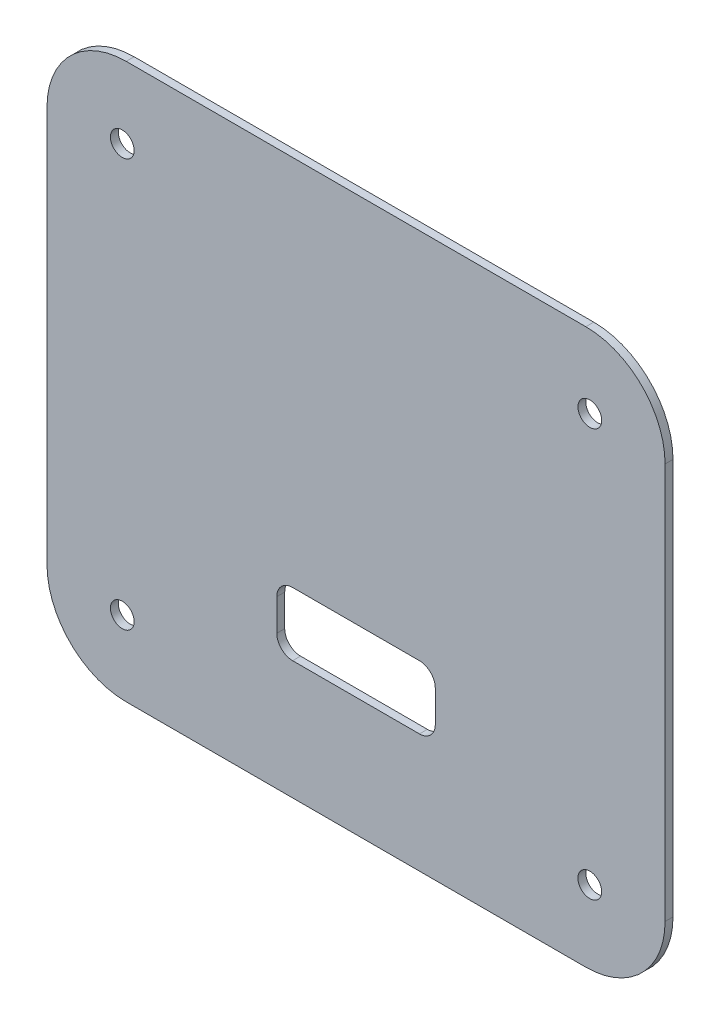
ISO-10303-21;
HEADER;
FILE_DESCRIPTION(('STEP AP214'),'2;1');
FILE_NAME('part.step','',(''),(''),'','','');
FILE_SCHEMA(('AUTOMOTIVE_DESIGN { 1 0 10303 214 1 1 1 1 }'));
ENDSEC;
DATA;
#1=APPLICATION_CONTEXT('core data for automotive mechanical design processes');
#2=APPLICATION_PROTOCOL_DEFINITION('international standard','automotive_design',2000,#1);
#3=PRODUCT_CONTEXT('',#1,'mechanical');
#4=PRODUCT('Part','Part','',(#3));
#5=PRODUCT_RELATED_PRODUCT_CATEGORY('part','',(#4));
#6=PRODUCT_DEFINITION_FORMATION('','',#4);
#7=PRODUCT_DEFINITION_CONTEXT('part definition',#1,'design');
#8=PRODUCT_DEFINITION('design','',#6,#7);
#9=PRODUCT_DEFINITION_SHAPE('','',#8);
#10=(LENGTH_UNIT() NAMED_UNIT(*) SI_UNIT(.MILLI.,.METRE.));
#11=(NAMED_UNIT(*) PLANE_ANGLE_UNIT() SI_UNIT($,.RADIAN.));
#12=(NAMED_UNIT(*) SI_UNIT($,.STERADIAN.) SOLID_ANGLE_UNIT());
#13=UNCERTAINTY_MEASURE_WITH_UNIT(LENGTH_MEASURE(1.E-05),#10,'distance_accuracy_value','');
#14=(GEOMETRIC_REPRESENTATION_CONTEXT(3) GLOBAL_UNCERTAINTY_ASSIGNED_CONTEXT((#13)) GLOBAL_UNIT_ASSIGNED_CONTEXT((#10,
#11,#12)) REPRESENTATION_CONTEXT('',''));
#15=CARTESIAN_POINT('',(0.,0.,0.));
#16=DIRECTION('',(0.,0.,1.));
#17=DIRECTION('',(1.,0.,0.));
#18=AXIS2_PLACEMENT_3D('',#15,#16,#17);
#19=CARTESIAN_POINT('',(38.9246009024166,0.,1.));
#20=DIRECTION('',(1.,0.,0.));
#21=DIRECTION('',(0.,1.,0.));
#22=AXIS2_PLACEMENT_3D('',#19,#20,#21);
#23=PLANE('',#22);
#24=DIRECTION('',(0.,-1.,0.));
#25=VECTOR('',#24,1.);
#26=CARTESIAN_POINT('',(38.9246009024166,0.,0.));
#27=LINE('',#26,#25);
#28=CARTESIAN_POINT('',(38.9246009024166,29.9501900989278,0.));
#29=VERTEX_POINT('',#28);
#30=CARTESIAN_POINT('',(38.9246009024166,-20.0498099010722,0.));
#31=VERTEX_POINT('',#30);
#32=EDGE_CURVE('E167',#29,#31,#27,.T.);
#33=ORIENTED_EDGE('',*,*,#32,.F.);
#34=DIRECTION('',(0.,0.,-1.));
#35=VECTOR('',#34,1.);
#36=CARTESIAN_POINT('',(38.9246009024166,29.9501900989278,1.));
#37=LINE('',#36,#35);
#38=CARTESIAN_POINT('',(38.9246009024166,29.9501900989278,1.));
#39=VERTEX_POINT('',#38);
#40=EDGE_CURVE('E189',#29,#39,#37,.F.);
#41=ORIENTED_EDGE('',*,*,#40,.T.);
#42=DIRECTION('',(0.,-1.,0.));
#43=VECTOR('',#42,1.);
#44=CARTESIAN_POINT('',(38.9246009024166,0.,1.));
#45=LINE('',#44,#43);
#46=CARTESIAN_POINT('',(38.9246009024166,-20.0498099010722,1.));
#47=VERTEX_POINT('',#46);
#48=EDGE_CURVE('E268',#39,#47,#45,.T.);
#49=ORIENTED_EDGE('',*,*,#48,.T.);
#50=DIRECTION('',(0.,0.,-1.));
#51=VECTOR('',#50,1.);
#52=CARTESIAN_POINT('',(38.9246009024166,-20.0498099010722,0.));
#53=LINE('',#52,#51);
#54=EDGE_CURVE('E186',#47,#31,#53,.T.);
#55=ORIENTED_EDGE('',*,*,#54,.T.);
#56=EDGE_LOOP('',(#33,#41,#49,#55));
#57=FACE_BOUND('',#56,.T.);
#58=ADVANCED_FACE('F32',(#57),#23,.T.);
#59=CARTESIAN_POINT('',(0.,39.9501900989278,1.));
#60=DIRECTION('',(0.,1.,0.));
#61=DIRECTION('',(0.,0.,1.));
#62=AXIS2_PLACEMENT_3D('',#59,#60,#61);
#63=PLANE('',#62);
#64=DIRECTION('',(1.,0.,0.));
#65=VECTOR('',#64,1.);
#66=CARTESIAN_POINT('',(0.,39.9501900989278,1.));
#67=LINE('',#66,#65);
#68=CARTESIAN_POINT('',(-29.0753990975834,39.9501900989278,1.));
#69=VERTEX_POINT('',#68);
#70=CARTESIAN_POINT('',(28.9246009024166,39.9501900989278,1.));
#71=VERTEX_POINT('',#70);
#72=EDGE_CURVE('E271',#69,#71,#67,.T.);
#73=ORIENTED_EDGE('',*,*,#72,.T.);
#74=DIRECTION('',(0.,0.,-1.));
#75=VECTOR('',#74,1.);
#76=CARTESIAN_POINT('',(28.9246009024166,39.9501900989278,1.));
#77=LINE('',#76,#75);
#78=CARTESIAN_POINT('',(28.9246009024166,39.9501900989278,0.));
#79=VERTEX_POINT('',#78);
#80=EDGE_CURVE('E166',#71,#79,#77,.T.);
#81=ORIENTED_EDGE('',*,*,#80,.T.);
#82=DIRECTION('',(1.,0.,0.));
#83=VECTOR('',#82,1.);
#84=CARTESIAN_POINT('',(0.,39.9501900989278,0.));
#85=LINE('',#84,#83);
#86=CARTESIAN_POINT('',(-29.0753990975834,39.9501900989278,0.));
#87=VERTEX_POINT('',#86);
#88=EDGE_CURVE('E149',#87,#79,#85,.T.);
#89=ORIENTED_EDGE('',*,*,#88,.F.);
#90=DIRECTION('',(0.,0.,-1.));
#91=VECTOR('',#90,1.);
#92=CARTESIAN_POINT('',(-29.0753990975834,39.9501900989278,1.));
#93=LINE('',#92,#91);
#94=EDGE_CURVE('E163',#87,#69,#93,.F.);
#95=ORIENTED_EDGE('',*,*,#94,.T.);
#96=EDGE_LOOP('',(#73,#81,#89,#95));
#97=FACE_BOUND('',#96,.T.);
#98=ADVANCED_FACE('F162',(#97),#63,.T.);
#99=CARTESIAN_POINT('',(-39.0753990975834,0.,1.));
#100=DIRECTION('',(1.,0.,0.));
#101=DIRECTION('',(0.,1.,0.));
#102=AXIS2_PLACEMENT_3D('',#99,#100,#101);
#103=PLANE('',#102);
#104=DIRECTION('',(0.,-1.,0.));
#105=VECTOR('',#104,1.);
#106=CARTESIAN_POINT('',(-39.0753990975834,0.,1.));
#107=LINE('',#106,#105);
#108=CARTESIAN_POINT('',(-39.0753990975834,29.9501900989278,1.));
#109=VERTEX_POINT('',#108);
#110=CARTESIAN_POINT('',(-39.0753990975834,-20.0498099010722,1.));
#111=VERTEX_POINT('',#110);
#112=EDGE_CURVE('E273',#109,#111,#107,.T.);
#113=ORIENTED_EDGE('',*,*,#112,.F.);
#114=DIRECTION('',(0.,0.,-1.));
#115=VECTOR('',#114,1.);
#116=CARTESIAN_POINT('',(-39.0753990975834,29.9501900989278,0.));
#117=LINE('',#116,#115);
#118=CARTESIAN_POINT('',(-39.0753990975834,29.9501900989278,0.));
#119=VERTEX_POINT('',#118);
#120=EDGE_CURVE('E200',#109,#119,#117,.T.);
#121=ORIENTED_EDGE('',*,*,#120,.T.);
#122=DIRECTION('',(0.,-1.,0.));
#123=VECTOR('',#122,1.);
#124=CARTESIAN_POINT('',(-39.0753990975834,0.,0.));
#125=LINE('',#124,#123);
#126=CARTESIAN_POINT('',(-39.0753990975834,-20.0498099010722,0.));
#127=VERTEX_POINT('',#126);
#128=EDGE_CURVE('E151',#119,#127,#125,.T.);
#129=ORIENTED_EDGE('',*,*,#128,.T.);
#130=DIRECTION('',(0.,0.,-1.));
#131=VECTOR('',#130,1.);
#132=CARTESIAN_POINT('',(-39.0753990975834,-20.0498099010722,1.));
#133=LINE('',#132,#131);
#134=EDGE_CURVE('E198',#127,#111,#133,.F.);
#135=ORIENTED_EDGE('',*,*,#134,.T.);
#136=EDGE_LOOP('',(#113,#121,#129,#135));
#137=FACE_BOUND('',#136,.T.);
#138=ADVANCED_FACE('F332',(#137),#103,.F.);
#139=CARTESIAN_POINT('',(0.,-15.0498099010722,1.));
#140=DIRECTION('',(0.,1.,0.));
#141=DIRECTION('',(0.,0.,1.));
#142=AXIS2_PLACEMENT_3D('',#139,#140,#141);
#143=PLANE('',#142);
#144=DIRECTION('',(1.,0.,0.));
#145=VECTOR('',#144,1.);
#146=CARTESIAN_POINT('',(0.,-15.0498099010722,1.));
#147=LINE('',#146,#145);
#148=CARTESIAN_POINT('',(-8.07539909758339,-15.0498099010722,1.));
#149=VERTEX_POINT('',#148);
#150=CARTESIAN_POINT('',(7.92460090241661,-15.0498099010722,1.));
#151=VERTEX_POINT('',#150);
#152=EDGE_CURVE('E256',#149,#151,#147,.T.);
#153=ORIENTED_EDGE('',*,*,#152,.T.);
#154=DIRECTION('',(0.,0.,-1.));
#155=VECTOR('',#154,1.);
#156=CARTESIAN_POINT('',(7.92460090241661,-15.0498099010722,0.));
#157=LINE('',#156,#155);
#158=CARTESIAN_POINT('',(7.92460090241661,-15.0498099010722,0.));
#159=VERTEX_POINT('',#158);
#160=EDGE_CURVE('E209',#151,#159,#157,.T.);
#161=ORIENTED_EDGE('',*,*,#160,.T.);
#162=DIRECTION('',(1.,0.,0.));
#163=VECTOR('',#162,1.);
#164=CARTESIAN_POINT('',(0.,-15.0498099010722,0.));
#165=LINE('',#164,#163);
#166=CARTESIAN_POINT('',(-8.07539909758339,-15.0498099010722,0.));
#167=VERTEX_POINT('',#166);
#168=EDGE_CURVE('E242',#167,#159,#165,.T.);
#169=ORIENTED_EDGE('',*,*,#168,.F.);
#170=DIRECTION('',(0.,0.,-1.));
#171=VECTOR('',#170,1.);
#172=CARTESIAN_POINT('',(-8.07539909758339,-15.0498099010722,1.));
#173=LINE('',#172,#171);
#174=EDGE_CURVE('E207',#167,#149,#173,.F.);
#175=ORIENTED_EDGE('',*,*,#174,.T.);
#176=EDGE_LOOP('',(#153,#161,#169,#175));
#177=FACE_BOUND('',#176,.T.);
#178=ADVANCED_FACE('F249',(#177),#143,.T.);
#179=CARTESIAN_POINT('',(-10.0753990975834,0.,1.));
#180=DIRECTION('',(-1.,0.,0.));
#181=DIRECTION('',(0.,0.,1.));
#182=AXIS2_PLACEMENT_3D('',#179,#180,#181);
#183=PLANE('',#182);
#184=DIRECTION('',(0.,1.,0.));
#185=VECTOR('',#184,1.);
#186=CARTESIAN_POINT('',(-10.0753990975834,0.,0.));
#187=LINE('',#186,#185);
#188=CARTESIAN_POINT('',(-10.0753990975834,-13.0498099010722,0.));
#189=VERTEX_POINT('',#188);
#190=CARTESIAN_POINT('',(-10.0753990975834,-9.04980990107219,0.));
#191=VERTEX_POINT('',#190);
#192=EDGE_CURVE('E243',#189,#191,#187,.T.);
#193=ORIENTED_EDGE('',*,*,#192,.T.);
#194=DIRECTION('',(0.,0.,-1.));
#195=VECTOR('',#194,1.);
#196=CARTESIAN_POINT('',(-10.0753990975834,-9.04980990107219,1.));
#197=LINE('',#196,#195);
#198=CARTESIAN_POINT('',(-10.0753990975834,-9.04980990107219,1.));
#199=VERTEX_POINT('',#198);
#200=EDGE_CURVE('E47',#191,#199,#197,.F.);
#201=ORIENTED_EDGE('',*,*,#200,.T.);
#202=DIRECTION('',(0.,1.,0.));
#203=VECTOR('',#202,1.);
#204=CARTESIAN_POINT('',(-10.0753990975834,0.,1.));
#205=LINE('',#204,#203);
#206=CARTESIAN_POINT('',(-10.0753990975834,-13.0498099010722,1.));
#207=VERTEX_POINT('',#206);
#208=EDGE_CURVE('E253',#207,#199,#205,.T.);
#209=ORIENTED_EDGE('',*,*,#208,.F.);
#210=DIRECTION('',(0.,0.,-1.));
#211=VECTOR('',#210,1.);
#212=CARTESIAN_POINT('',(-10.0753990975834,-13.0498099010722,1.));
#213=LINE('',#212,#211);
#214=EDGE_CURVE('E222',#207,#189,#213,.T.);
#215=ORIENTED_EDGE('',*,*,#214,.T.);
#216=EDGE_LOOP('',(#193,#201,#209,#215));
#217=FACE_BOUND('',#216,.T.);
#218=ADVANCED_FACE('F252',(#217),#183,.F.);
#219=CARTESIAN_POINT('',(0.,-7.04980990107219,1.));
#220=DIRECTION('',(0.,1.,0.));
#221=DIRECTION('',(0.,0.,1.));
#222=AXIS2_PLACEMENT_3D('',#219,#220,#221);
#223=PLANE('',#222);
#224=DIRECTION('',(1.,0.,0.));
#225=VECTOR('',#224,1.);
#226=CARTESIAN_POINT('',(0.,-7.04980990107219,0.));
#227=LINE('',#226,#225);
#228=CARTESIAN_POINT('',(-8.07539909758339,-7.04980990107219,0.));
#229=VERTEX_POINT('',#228);
#230=CARTESIAN_POINT('',(7.92460090241661,-7.04980990107219,0.));
#231=VERTEX_POINT('',#230);
#232=EDGE_CURVE('E285',#229,#231,#227,.T.);
#233=ORIENTED_EDGE('',*,*,#232,.T.);
#234=DIRECTION('',(0.,0.,-1.));
#235=VECTOR('',#234,1.);
#236=CARTESIAN_POINT('',(7.92460090241661,-7.04980990107219,1.));
#237=LINE('',#236,#235);
#238=CARTESIAN_POINT('',(7.92460090241661,-7.04980990107219,1.));
#239=VERTEX_POINT('',#238);
#240=EDGE_CURVE('E220',#231,#239,#237,.F.);
#241=ORIENTED_EDGE('',*,*,#240,.T.);
#242=DIRECTION('',(1.,0.,0.));
#243=VECTOR('',#242,1.);
#244=CARTESIAN_POINT('',(0.,-7.04980990107219,1.));
#245=LINE('',#244,#243);
#246=CARTESIAN_POINT('',(-8.07539909758339,-7.04980990107219,1.));
#247=VERTEX_POINT('',#246);
#248=EDGE_CURVE('E255',#247,#239,#245,.T.);
#249=ORIENTED_EDGE('',*,*,#248,.F.);
#250=DIRECTION('',(0.,0.,-1.));
#251=VECTOR('',#250,1.);
#252=CARTESIAN_POINT('',(-8.07539909758339,-7.04980990107219,0.));
#253=LINE('',#252,#251);
#254=EDGE_CURVE('E217',#247,#229,#253,.T.);
#255=ORIENTED_EDGE('',*,*,#254,.T.);
#256=EDGE_LOOP('',(#233,#241,#249,#255));
#257=FACE_BOUND('',#256,.T.);
#258=ADVANCED_FACE('F341',(#257),#223,.F.);
#259=CARTESIAN_POINT('',(-29.5753990975834,30.7001900989278,1.));
#260=DIRECTION('',(0.,0.,-1.));
#261=DIRECTION('',(-1.,0.,0.));
#262=AXIS2_PLACEMENT_3D('',#259,#260,#261);
#263=CYLINDRICAL_SURFACE('',#262,1.5);
#264=CARTESIAN_POINT('',(-29.5753990975834,30.7001900989278,1.));
#265=DIRECTION('',(0.,0.,1.));
#266=DIRECTION('',(1.,0.,0.));
#267=AXIS2_PLACEMENT_3D('',#264,#265,#266);
#268=CIRCLE('',#267,1.5);
#269=CARTESIAN_POINT('',(-28.0753990975834,30.7001900989278,1.));
#270=VERTEX_POINT('',#269);
#271=EDGE_CURVE('E177',#270,#270,#268,.T.);
#272=ORIENTED_EDGE('',*,*,#271,.T.);
#273=EDGE_LOOP('',(#272));
#274=FACE_BOUND('',#273,.T.);
#275=CARTESIAN_POINT('',(-29.5753990975834,30.7001900989278,0.));
#276=DIRECTION('',(0.,0.,1.));
#277=DIRECTION('',(1.,0.,0.));
#278=AXIS2_PLACEMENT_3D('',#275,#276,#277);
#279=CIRCLE('',#278,1.5);
#280=CARTESIAN_POINT('',(-28.0753990975834,30.7001900989278,0.));
#281=VERTEX_POINT('',#280);
#282=EDGE_CURVE('E302',#281,#281,#279,.T.);
#283=ORIENTED_EDGE('',*,*,#282,.F.);
#284=EDGE_LOOP('',(#283));
#285=FACE_BOUND('',#284,.T.);
#286=ADVANCED_FACE('F344',(#274,#285),#263,.F.);
#287=CARTESIAN_POINT('',(29.4246009024166,30.7001900989278,1.));
#288=DIRECTION('',(0.,0.,-1.));
#289=DIRECTION('',(-1.,0.,0.));
#290=AXIS2_PLACEMENT_3D('',#287,#288,#289);
#291=CYLINDRICAL_SURFACE('',#290,1.5);
#292=CARTESIAN_POINT('',(29.4246009024166,30.7001900989278,1.));
#293=DIRECTION('',(0.,0.,1.));
#294=DIRECTION('',(1.,0.,0.));
#295=AXIS2_PLACEMENT_3D('',#292,#293,#294);
#296=CIRCLE('',#295,1.5);
#297=CARTESIAN_POINT('',(30.9246009024166,30.7001900989278,1.));
#298=VERTEX_POINT('',#297);
#299=EDGE_CURVE('E279',#298,#298,#296,.T.);
#300=ORIENTED_EDGE('',*,*,#299,.T.);
#301=EDGE_LOOP('',(#300));
#302=FACE_BOUND('',#301,.T.);
#303=CARTESIAN_POINT('',(29.4246009024166,30.7001900989278,0.));
#304=DIRECTION('',(0.,0.,1.));
#305=DIRECTION('',(1.,0.,0.));
#306=AXIS2_PLACEMENT_3D('',#303,#304,#305);
#307=CIRCLE('',#306,1.5);
#308=CARTESIAN_POINT('',(30.9246009024166,30.7001900989278,0.));
#309=VERTEX_POINT('',#308);
#310=EDGE_CURVE('E300',#309,#309,#307,.T.);
#311=ORIENTED_EDGE('',*,*,#310,.F.);
#312=EDGE_LOOP('',(#311));
#313=FACE_BOUND('',#312,.T.);
#314=ADVANCED_FACE('F401',(#302,#313),#291,.F.);
#315=CARTESIAN_POINT('',(0.,-30.0498099010722,1.));
#316=DIRECTION('',(0.,1.,0.));
#317=DIRECTION('',(0.,0.,1.));
#318=AXIS2_PLACEMENT_3D('',#315,#316,#317);
#319=PLANE('',#318);
#320=DIRECTION('',(1.,0.,0.));
#321=VECTOR('',#320,1.);
#322=CARTESIAN_POINT('',(0.,-30.0498099010722,1.));
#323=LINE('',#322,#321);
#324=CARTESIAN_POINT('',(-29.0753990975834,-30.0498099010722,1.));
#325=VERTEX_POINT('',#324);
#326=CARTESIAN_POINT('',(28.9246009024166,-30.0498099010722,1.));
#327=VERTEX_POINT('',#326);
#328=EDGE_CURVE('E276',#325,#327,#323,.T.);
#329=ORIENTED_EDGE('',*,*,#328,.F.);
#330=DIRECTION('',(0.,0.,-1.));
#331=VECTOR('',#330,1.);
#332=CARTESIAN_POINT('',(-29.0753990975834,-30.0498099010722,1.));
#333=LINE('',#332,#331);
#334=CARTESIAN_POINT('',(-29.0753990975834,-30.0498099010722,0.));
#335=VERTEX_POINT('',#334);
#336=EDGE_CURVE('E204',#325,#335,#333,.T.);
#337=ORIENTED_EDGE('',*,*,#336,.T.);
#338=DIRECTION('',(1.,0.,0.));
#339=VECTOR('',#338,1.);
#340=CARTESIAN_POINT('',(0.,-30.0498099010722,0.));
#341=LINE('',#340,#339);
#342=CARTESIAN_POINT('',(28.9246009024166,-30.0498099010722,0.));
#343=VERTEX_POINT('',#342);
#344=EDGE_CURVE('E297',#335,#343,#341,.T.);
#345=ORIENTED_EDGE('',*,*,#344,.T.);
#346=DIRECTION('',(0.,0.,-1.));
#347=VECTOR('',#346,1.);
#348=CARTESIAN_POINT('',(28.9246009024166,-30.0498099010722,1.));
#349=LINE('',#348,#347);
#350=EDGE_CURVE('E202',#343,#327,#349,.F.);
#351=ORIENTED_EDGE('',*,*,#350,.T.);
#352=EDGE_LOOP('',(#329,#337,#345,#351));
#353=FACE_BOUND('',#352,.T.);
#354=ADVANCED_FACE('F338',(#353),#319,.F.);
#355=CARTESIAN_POINT('',(29.4246009024166,-20.7998099010722,1.));
#356=DIRECTION('',(0.,0.,-1.));
#357=DIRECTION('',(-1.,0.,0.));
#358=AXIS2_PLACEMENT_3D('',#355,#356,#357);
#359=CYLINDRICAL_SURFACE('',#358,1.5);
#360=CARTESIAN_POINT('',(29.4246009024166,-20.7998099010722,1.));
#361=DIRECTION('',(0.,0.,1.));
#362=DIRECTION('',(1.,0.,0.));
#363=AXIS2_PLACEMENT_3D('',#360,#361,#362);
#364=CIRCLE('',#363,1.5);
#365=CARTESIAN_POINT('',(30.9246009024166,-20.7998099010722,1.));
#366=VERTEX_POINT('',#365);
#367=EDGE_CURVE('E265',#366,#366,#364,.T.);
#368=ORIENTED_EDGE('',*,*,#367,.T.);
#369=EDGE_LOOP('',(#368));
#370=FACE_BOUND('',#369,.T.);
#371=CARTESIAN_POINT('',(29.4246009024166,-20.7998099010722,0.));
#372=DIRECTION('',(0.,0.,1.));
#373=DIRECTION('',(1.,0.,0.));
#374=AXIS2_PLACEMENT_3D('',#371,#372,#373);
#375=CIRCLE('',#374,1.5);
#376=CARTESIAN_POINT('',(30.9246009024166,-20.7998099010722,0.));
#377=VERTEX_POINT('',#376);
#378=EDGE_CURVE('E291',#377,#377,#375,.T.);
#379=ORIENTED_EDGE('',*,*,#378,.F.);
#380=EDGE_LOOP('',(#379));
#381=FACE_BOUND('',#380,.T.);
#382=ADVANCED_FACE('F321',(#370,#381),#359,.F.);
#383=CARTESIAN_POINT('',(9.92460090241661,0.,1.));
#384=DIRECTION('',(-1.,0.,0.));
#385=DIRECTION('',(0.,-1.,0.));
#386=AXIS2_PLACEMENT_3D('',#383,#384,#385);
#387=PLANE('',#386);
#388=DIRECTION('',(0.,1.,0.));
#389=VECTOR('',#388,1.);
#390=CARTESIAN_POINT('',(9.92460090241661,0.,0.));
#391=LINE('',#390,#389);
#392=CARTESIAN_POINT('',(9.92460090241661,-13.0498099010722,0.));
#393=VERTEX_POINT('',#392);
#394=CARTESIAN_POINT('',(9.92460090241661,-9.04980990107219,0.));
#395=VERTEX_POINT('',#394);
#396=EDGE_CURVE('E288',#393,#395,#391,.T.);
#397=ORIENTED_EDGE('',*,*,#396,.F.);
#398=DIRECTION('',(0.,0.,-1.));
#399=VECTOR('',#398,1.);
#400=CARTESIAN_POINT('',(9.92460090241661,-13.0498099010722,1.));
#401=LINE('',#400,#399);
#402=CARTESIAN_POINT('',(9.92460090241661,-13.0498099010722,1.));
#403=VERTEX_POINT('',#402);
#404=EDGE_CURVE('E215',#393,#403,#401,.F.);
#405=ORIENTED_EDGE('',*,*,#404,.T.);
#406=DIRECTION('',(0.,1.,0.));
#407=VECTOR('',#406,1.);
#408=CARTESIAN_POINT('',(9.92460090241661,0.,1.));
#409=LINE('',#408,#407);
#410=CARTESIAN_POINT('',(9.92460090241661,-9.04980990107219,1.));
#411=VERTEX_POINT('',#410);
#412=EDGE_CURVE('E259',#403,#411,#409,.T.);
#413=ORIENTED_EDGE('',*,*,#412,.T.);
#414=DIRECTION('',(0.,0.,-1.));
#415=VECTOR('',#414,1.);
#416=CARTESIAN_POINT('',(9.92460090241661,-9.04980990107219,1.));
#417=LINE('',#416,#415);
#418=EDGE_CURVE('E212',#411,#395,#417,.T.);
#419=ORIENTED_EDGE('',*,*,#418,.T.);
#420=EDGE_LOOP('',(#397,#405,#413,#419));
#421=FACE_BOUND('',#420,.T.);
#422=ADVANCED_FACE('F313',(#421),#387,.T.);
#423=CARTESIAN_POINT('',(-29.5753990975834,-20.7998099010722,1.));
#424=DIRECTION('',(0.,0.,-1.));
#425=DIRECTION('',(-1.,0.,0.));
#426=AXIS2_PLACEMENT_3D('',#423,#424,#425);
#427=CYLINDRICAL_SURFACE('',#426,1.5);
#428=CARTESIAN_POINT('',(-29.5753990975834,-20.7998099010722,1.));
#429=DIRECTION('',(0.,0.,1.));
#430=DIRECTION('',(1.,0.,0.));
#431=AXIS2_PLACEMENT_3D('',#428,#429,#430);
#432=CIRCLE('',#431,1.5);
#433=CARTESIAN_POINT('',(-28.0753990975834,-20.7998099010722,1.));
#434=VERTEX_POINT('',#433);
#435=EDGE_CURVE('E172',#434,#434,#432,.T.);
#436=ORIENTED_EDGE('',*,*,#435,.T.);
#437=EDGE_LOOP('',(#436));
#438=FACE_BOUND('',#437,.T.);
#439=CARTESIAN_POINT('',(-29.5753990975834,-20.7998099010722,0.));
#440=DIRECTION('',(0.,0.,1.));
#441=DIRECTION('',(1.,0.,0.));
#442=AXIS2_PLACEMENT_3D('',#439,#440,#441);
#443=CIRCLE('',#442,1.5);
#444=CARTESIAN_POINT('',(-28.0753990975834,-20.7998099010722,0.));
#445=VERTEX_POINT('',#444);
#446=EDGE_CURVE('E180',#445,#445,#443,.T.);
#447=ORIENTED_EDGE('',*,*,#446,.F.);
#448=EDGE_LOOP('',(#447));
#449=FACE_BOUND('',#448,.T.);
#450=ADVANCED_FACE('F310',(#438,#449),#427,.F.);
#451=CARTESIAN_POINT('',(0.,0.,1.));
#452=DIRECTION('',(0.,0.,1.));
#453=DIRECTION('',(1.,0.,0.));
#454=AXIS2_PLACEMENT_3D('',#451,#452,#453);
#455=PLANE('',#454);
#456=ORIENTED_EDGE('',*,*,#152,.F.);
#457=CARTESIAN_POINT('',(-8.07539909758339,-13.0498099010722,1.));
#458=DIRECTION('',(0.,0.,1.));
#459=DIRECTION('',(1.,0.,0.));
#460=AXIS2_PLACEMENT_3D('',#457,#458,#459);
#461=CIRCLE('',#460,2.);
#462=EDGE_CURVE('E11',#149,#207,#461,.F.);
#463=ORIENTED_EDGE('',*,*,#462,.T.);
#464=ORIENTED_EDGE('',*,*,#208,.T.);
#465=CARTESIAN_POINT('',(-8.07539909758339,-9.04980990107219,1.));
#466=DIRECTION('',(0.,0.,1.));
#467=DIRECTION('',(1.,0.,0.));
#468=AXIS2_PLACEMENT_3D('',#465,#466,#467);
#469=CIRCLE('',#468,2.);
#470=EDGE_CURVE('E236',#199,#247,#469,.F.);
#471=ORIENTED_EDGE('',*,*,#470,.T.);
#472=ORIENTED_EDGE('',*,*,#248,.T.);
#473=CARTESIAN_POINT('',(7.92460090241661,-9.04980990107219,1.));
#474=DIRECTION('',(0.,0.,1.));
#475=DIRECTION('',(1.,0.,0.));
#476=AXIS2_PLACEMENT_3D('',#473,#474,#475);
#477=CIRCLE('',#476,2.);
#478=EDGE_CURVE('E232',#239,#411,#477,.F.);
#479=ORIENTED_EDGE('',*,*,#478,.T.);
#480=ORIENTED_EDGE('',*,*,#412,.F.);
#481=CARTESIAN_POINT('',(7.92460090241661,-13.0498099010722,1.));
#482=DIRECTION('',(0.,0.,1.));
#483=DIRECTION('',(1.,0.,0.));
#484=AXIS2_PLACEMENT_3D('',#481,#482,#483);
#485=CIRCLE('',#484,2.);
#486=EDGE_CURVE('E228',#403,#151,#485,.F.);
#487=ORIENTED_EDGE('',*,*,#486,.T.);
#488=EDGE_LOOP('',(#456,#463,#464,#471,#472,#479,#480,#487));
#489=FACE_BOUND('',#488,.T.);
#490=ORIENTED_EDGE('',*,*,#367,.F.);
#491=EDGE_LOOP('',(#490));
#492=FACE_BOUND('',#491,.T.);
#493=ORIENTED_EDGE('',*,*,#48,.F.);
#494=CARTESIAN_POINT('',(28.9246009024166,29.9501900989278,1.));
#495=DIRECTION('',(0.,0.,1.));
#496=DIRECTION('',(1.,0.,0.));
#497=AXIS2_PLACEMENT_3D('',#494,#495,#496);
#498=CIRCLE('',#497,10.);
#499=EDGE_CURVE('E196',#39,#71,#498,.T.);
#500=ORIENTED_EDGE('',*,*,#499,.T.);
#501=ORIENTED_EDGE('',*,*,#72,.F.);
#502=CARTESIAN_POINT('',(-29.0753990975834,29.9501900989278,1.));
#503=DIRECTION('',(0.,0.,1.));
#504=DIRECTION('',(1.,0.,0.));
#505=AXIS2_PLACEMENT_3D('',#502,#503,#504);
#506=CIRCLE('',#505,10.);
#507=EDGE_CURVE('E171',#69,#109,#506,.T.);
#508=ORIENTED_EDGE('',*,*,#507,.T.);
#509=ORIENTED_EDGE('',*,*,#112,.T.);
#510=CARTESIAN_POINT('',(-29.0753990975834,-20.0498099010722,1.));
#511=DIRECTION('',(0.,0.,1.));
#512=DIRECTION('',(1.,0.,0.));
#513=AXIS2_PLACEMENT_3D('',#510,#511,#512);
#514=CIRCLE('',#513,10.);
#515=EDGE_CURVE('E193',#111,#325,#514,.T.);
#516=ORIENTED_EDGE('',*,*,#515,.T.);
#517=ORIENTED_EDGE('',*,*,#328,.T.);
#518=CARTESIAN_POINT('',(28.9246009024166,-20.0498099010722,1.));
#519=DIRECTION('',(0.,0.,1.));
#520=DIRECTION('',(1.,0.,0.));
#521=AXIS2_PLACEMENT_3D('',#518,#519,#520);
#522=CIRCLE('',#521,10.);
#523=EDGE_CURVE('E191',#327,#47,#522,.T.);
#524=ORIENTED_EDGE('',*,*,#523,.T.);
#525=EDGE_LOOP('',(#493,#500,#501,#508,#509,#516,#517,#524));
#526=FACE_BOUND('',#525,.T.);
#527=ORIENTED_EDGE('',*,*,#299,.F.);
#528=EDGE_LOOP('',(#527));
#529=FACE_BOUND('',#528,.T.);
#530=ORIENTED_EDGE('',*,*,#271,.F.);
#531=EDGE_LOOP('',(#530));
#532=FACE_BOUND('',#531,.T.);
#533=ORIENTED_EDGE('',*,*,#435,.F.);
#534=EDGE_LOOP('',(#533));
#535=FACE_BOUND('',#534,.T.);
#536=ADVANCED_FACE('F312',(#489,#492,#526,#529,#532,#535),#455,.T.);
#537=CARTESIAN_POINT('',(0.,0.,0.));
#538=DIRECTION('',(0.,0.,1.));
#539=DIRECTION('',(1.,0.,0.));
#540=AXIS2_PLACEMENT_3D('',#537,#538,#539);
#541=PLANE('',#540);
#542=ORIENTED_EDGE('',*,*,#192,.F.);
#543=CARTESIAN_POINT('',(-8.07539909758339,-13.0498099010722,0.));
#544=DIRECTION('',(0.,0.,1.));
#545=DIRECTION('',(1.,0.,0.));
#546=AXIS2_PLACEMENT_3D('',#543,#544,#545);
#547=CIRCLE('',#546,2.);
#548=EDGE_CURVE('E40',#189,#167,#547,.T.);
#549=ORIENTED_EDGE('',*,*,#548,.T.);
#550=ORIENTED_EDGE('',*,*,#168,.T.);
#551=CARTESIAN_POINT('',(7.92460090241661,-13.0498099010722,0.));
#552=DIRECTION('',(0.,0.,1.));
#553=DIRECTION('',(1.,0.,0.));
#554=AXIS2_PLACEMENT_3D('',#551,#552,#553);
#555=CIRCLE('',#554,2.);
#556=EDGE_CURVE('E226',#159,#393,#555,.T.);
#557=ORIENTED_EDGE('',*,*,#556,.T.);
#558=ORIENTED_EDGE('',*,*,#396,.T.);
#559=CARTESIAN_POINT('',(7.92460090241661,-9.04980990107219,0.));
#560=DIRECTION('',(0.,0.,1.));
#561=DIRECTION('',(1.,0.,0.));
#562=AXIS2_PLACEMENT_3D('',#559,#560,#561);
#563=CIRCLE('',#562,2.);
#564=EDGE_CURVE('E230',#395,#231,#563,.T.);
#565=ORIENTED_EDGE('',*,*,#564,.T.);
#566=ORIENTED_EDGE('',*,*,#232,.F.);
#567=CARTESIAN_POINT('',(-8.07539909758339,-9.04980990107219,0.));
#568=DIRECTION('',(0.,0.,1.));
#569=DIRECTION('',(1.,0.,0.));
#570=AXIS2_PLACEMENT_3D('',#567,#568,#569);
#571=CIRCLE('',#570,2.);
#572=EDGE_CURVE('E234',#229,#191,#571,.T.);
#573=ORIENTED_EDGE('',*,*,#572,.T.);
#574=EDGE_LOOP('',(#542,#549,#550,#557,#558,#565,#566,#573));
#575=FACE_BOUND('',#574,.T.);
#576=ORIENTED_EDGE('',*,*,#378,.T.);
#577=EDGE_LOOP('',(#576));
#578=FACE_BOUND('',#577,.T.);
#579=ORIENTED_EDGE('',*,*,#88,.T.);
#580=CARTESIAN_POINT('',(28.9246009024166,29.9501900989278,0.));
#581=DIRECTION('',(0.,0.,1.));
#582=DIRECTION('',(1.,0.,0.));
#583=AXIS2_PLACEMENT_3D('',#580,#581,#582);
#584=CIRCLE('',#583,10.);
#585=EDGE_CURVE('E156',#79,#29,#584,.F.);
#586=ORIENTED_EDGE('',*,*,#585,.T.);
#587=ORIENTED_EDGE('',*,*,#32,.T.);
#588=CARTESIAN_POINT('',(28.9246009024166,-20.0498099010722,0.));
#589=DIRECTION('',(0.,0.,1.));
#590=DIRECTION('',(1.,0.,0.));
#591=AXIS2_PLACEMENT_3D('',#588,#589,#590);
#592=CIRCLE('',#591,10.);
#593=EDGE_CURVE('E174',#31,#343,#592,.F.);
#594=ORIENTED_EDGE('',*,*,#593,.T.);
#595=ORIENTED_EDGE('',*,*,#344,.F.);
#596=CARTESIAN_POINT('',(-29.0753990975834,-20.0498099010722,0.));
#597=DIRECTION('',(0.,0.,1.));
#598=DIRECTION('',(1.,0.,0.));
#599=AXIS2_PLACEMENT_3D('',#596,#597,#598);
#600=CIRCLE('',#599,10.);
#601=EDGE_CURVE('E157',#335,#127,#600,.F.);
#602=ORIENTED_EDGE('',*,*,#601,.T.);
#603=ORIENTED_EDGE('',*,*,#128,.F.);
#604=CARTESIAN_POINT('',(-29.0753990975834,29.9501900989278,0.));
#605=DIRECTION('',(0.,0.,1.));
#606=DIRECTION('',(1.,0.,0.));
#607=AXIS2_PLACEMENT_3D('',#604,#605,#606);
#608=CIRCLE('',#607,10.);
#609=EDGE_CURVE('E145',#119,#87,#608,.F.);
#610=ORIENTED_EDGE('',*,*,#609,.T.);
#611=EDGE_LOOP('',(#579,#586,#587,#594,#595,#602,#603,#610));
#612=FACE_BOUND('',#611,.T.);
#613=ORIENTED_EDGE('',*,*,#310,.T.);
#614=EDGE_LOOP('',(#613));
#615=FACE_BOUND('',#614,.T.);
#616=ORIENTED_EDGE('',*,*,#282,.T.);
#617=EDGE_LOOP('',(#616));
#618=FACE_BOUND('',#617,.T.);
#619=ORIENTED_EDGE('',*,*,#446,.T.);
#620=EDGE_LOOP('',(#619));
#621=FACE_BOUND('',#620,.T.);
#622=ADVANCED_FACE('F147',(#575,#578,#612,#615,#618,#621),#541,.F.);
#623=CARTESIAN_POINT('',(28.9246009024166,29.9501900989278,1.));
#624=DIRECTION('',(0.,0.,-1.));
#625=DIRECTION('',(-1.,0.,0.));
#626=AXIS2_PLACEMENT_3D('',#623,#624,#625);
#627=CYLINDRICAL_SURFACE('',#626,10.);
#628=ORIENTED_EDGE('',*,*,#499,.F.);
#629=ORIENTED_EDGE('',*,*,#40,.F.);
#630=ORIENTED_EDGE('',*,*,#585,.F.);
#631=ORIENTED_EDGE('',*,*,#80,.F.);
#632=EDGE_LOOP('',(#628,#629,#630,#631));
#633=FACE_BOUND('',#632,.T.);
#634=ADVANCED_FACE('F350',(#633),#627,.T.);
#635=CARTESIAN_POINT('',(-29.0753990975834,29.9501900989278,1.));
#636=DIRECTION('',(0.,0.,1.));
#637=DIRECTION('',(1.,0.,0.));
#638=AXIS2_PLACEMENT_3D('',#635,#636,#637);
#639=CYLINDRICAL_SURFACE('',#638,10.);
#640=ORIENTED_EDGE('',*,*,#507,.F.);
#641=ORIENTED_EDGE('',*,*,#94,.F.);
#642=ORIENTED_EDGE('',*,*,#609,.F.);
#643=ORIENTED_EDGE('',*,*,#120,.F.);
#644=EDGE_LOOP('',(#640,#641,#642,#643));
#645=FACE_BOUND('',#644,.T.);
#646=ADVANCED_FACE('F170',(#645),#639,.T.);
#647=CARTESIAN_POINT('',(-29.0753990975834,-20.0498099010722,1.));
#648=DIRECTION('',(0.,0.,-1.));
#649=DIRECTION('',(-1.,0.,0.));
#650=AXIS2_PLACEMENT_3D('',#647,#648,#649);
#651=CYLINDRICAL_SURFACE('',#650,10.);
#652=ORIENTED_EDGE('',*,*,#515,.F.);
#653=ORIENTED_EDGE('',*,*,#134,.F.);
#654=ORIENTED_EDGE('',*,*,#601,.F.);
#655=ORIENTED_EDGE('',*,*,#336,.F.);
#656=EDGE_LOOP('',(#652,#653,#654,#655));
#657=FACE_BOUND('',#656,.T.);
#658=ADVANCED_FACE('F356',(#657),#651,.T.);
#659=CARTESIAN_POINT('',(28.9246009024166,-20.0498099010722,1.));
#660=DIRECTION('',(0.,0.,1.));
#661=DIRECTION('',(1.,0.,0.));
#662=AXIS2_PLACEMENT_3D('',#659,#660,#661);
#663=CYLINDRICAL_SURFACE('',#662,10.);
#664=ORIENTED_EDGE('',*,*,#523,.F.);
#665=ORIENTED_EDGE('',*,*,#350,.F.);
#666=ORIENTED_EDGE('',*,*,#593,.F.);
#667=ORIENTED_EDGE('',*,*,#54,.F.);
#668=EDGE_LOOP('',(#664,#665,#666,#667));
#669=FACE_BOUND('',#668,.T.);
#670=ADVANCED_FACE('F359',(#669),#663,.T.);
#671=CARTESIAN_POINT('',(7.92460090241661,-13.0498099010722,1.));
#672=DIRECTION('',(0.,0.,1.));
#673=DIRECTION('',(1.,0.,0.));
#674=AXIS2_PLACEMENT_3D('',#671,#672,#673);
#675=CYLINDRICAL_SURFACE('',#674,2.);
#676=ORIENTED_EDGE('',*,*,#486,.F.);
#677=ORIENTED_EDGE('',*,*,#404,.F.);
#678=ORIENTED_EDGE('',*,*,#556,.F.);
#679=ORIENTED_EDGE('',*,*,#160,.F.);
#680=EDGE_LOOP('',(#676,#677,#678,#679));
#681=FACE_BOUND('',#680,.T.);
#682=ADVANCED_FACE('F363',(#681),#675,.F.);
#683=CARTESIAN_POINT('',(7.92460090241661,-9.04980990107219,1.));
#684=DIRECTION('',(0.,0.,-1.));
#685=DIRECTION('',(-1.,0.,0.));
#686=AXIS2_PLACEMENT_3D('',#683,#684,#685);
#687=CYLINDRICAL_SURFACE('',#686,2.);
#688=ORIENTED_EDGE('',*,*,#478,.F.);
#689=ORIENTED_EDGE('',*,*,#240,.F.);
#690=ORIENTED_EDGE('',*,*,#564,.F.);
#691=ORIENTED_EDGE('',*,*,#418,.F.);
#692=EDGE_LOOP('',(#688,#689,#690,#691));
#693=FACE_BOUND('',#692,.T.);
#694=ADVANCED_FACE('F367',(#693),#687,.F.);
#695=CARTESIAN_POINT('',(-8.07539909758339,-9.04980990107219,1.));
#696=DIRECTION('',(0.,0.,1.));
#697=DIRECTION('',(1.,0.,0.));
#698=AXIS2_PLACEMENT_3D('',#695,#696,#697);
#699=CYLINDRICAL_SURFACE('',#698,2.);
#700=ORIENTED_EDGE('',*,*,#470,.F.);
#701=ORIENTED_EDGE('',*,*,#200,.F.);
#702=ORIENTED_EDGE('',*,*,#572,.F.);
#703=ORIENTED_EDGE('',*,*,#254,.F.);
#704=EDGE_LOOP('',(#700,#701,#702,#703));
#705=FACE_BOUND('',#704,.T.);
#706=ADVANCED_FACE('F370',(#705),#699,.F.);
#707=CARTESIAN_POINT('',(-8.07539909758339,-13.0498099010722,1.));
#708=DIRECTION('',(0.,0.,-1.));
#709=DIRECTION('',(-1.,0.,0.));
#710=AXIS2_PLACEMENT_3D('',#707,#708,#709);
#711=CYLINDRICAL_SURFACE('',#710,2.);
#712=ORIENTED_EDGE('',*,*,#462,.F.);
#713=ORIENTED_EDGE('',*,*,#174,.F.);
#714=ORIENTED_EDGE('',*,*,#548,.F.);
#715=ORIENTED_EDGE('',*,*,#214,.F.);
#716=EDGE_LOOP('',(#712,#713,#714,#715));
#717=FACE_BOUND('',#716,.T.);
#718=ADVANCED_FACE('F34',(#717),#711,.F.);
#719=CLOSED_SHELL('',(#58,#98,#138,#178,#218,#258,#286,#314,#354,#382,#422,#450,#536,#622,#634,
#646,#658,#670,#682,#694,#706,#718));
#720=MANIFOLD_SOLID_BREP('B2',#719);
#721=ADVANCED_BREP_SHAPE_REPRESENTATION('',(#18,#720),#14);
#722=SHAPE_DEFINITION_REPRESENTATION(#9,#721);
ENDSEC;
END-ISO-10303-21;
